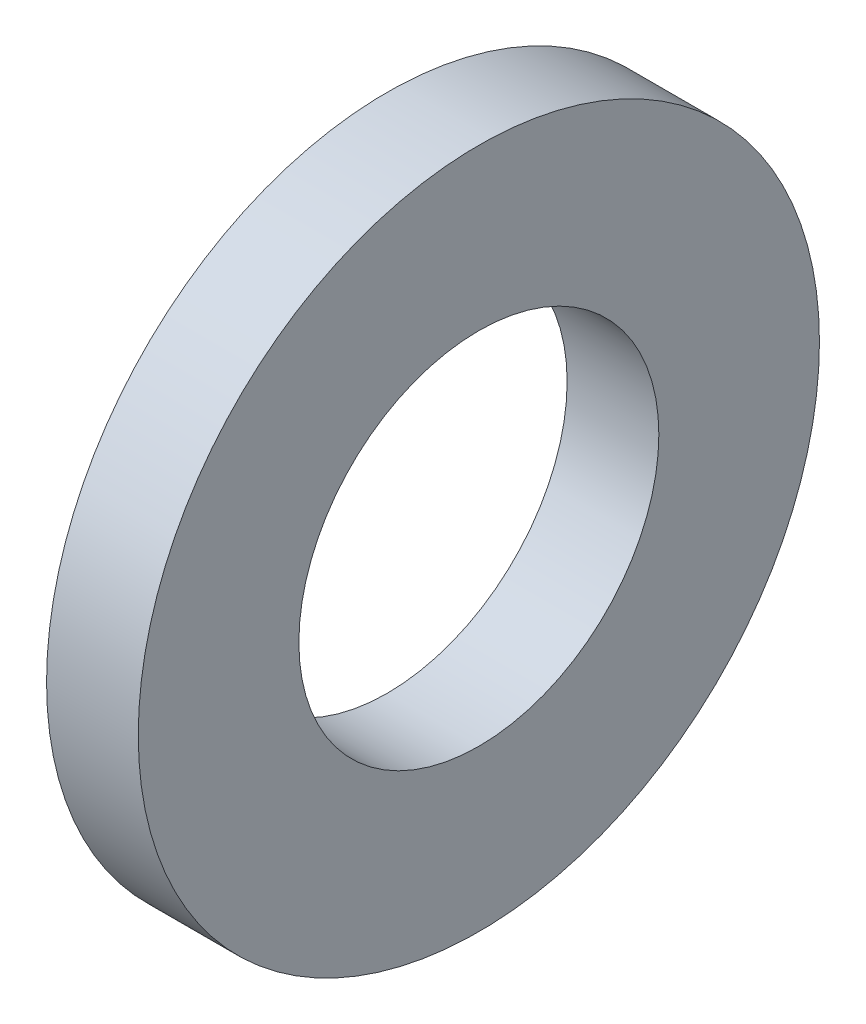
ISO-10303-21;
HEADER;
FILE_DESCRIPTION(('STEP AP214'),'2;1');
FILE_NAME('part.step','',(''),(''),'','','');
FILE_SCHEMA(('AUTOMOTIVE_DESIGN { 1 0 10303 214 1 1 1 1 }'));
ENDSEC;
DATA;
#1=APPLICATION_CONTEXT('core data for automotive mechanical design processes');
#2=APPLICATION_PROTOCOL_DEFINITION('international standard','automotive_design',2000,#1);
#3=PRODUCT_CONTEXT('',#1,'mechanical');
#4=PRODUCT('Part','Part','',(#3));
#5=PRODUCT_RELATED_PRODUCT_CATEGORY('part','',(#4));
#6=PRODUCT_DEFINITION_FORMATION('','',#4);
#7=PRODUCT_DEFINITION_CONTEXT('part definition',#1,'design');
#8=PRODUCT_DEFINITION('design','',#6,#7);
#9=PRODUCT_DEFINITION_SHAPE('','',#8);
#10=(LENGTH_UNIT() NAMED_UNIT(*) SI_UNIT(.MILLI.,.METRE.));
#11=(NAMED_UNIT(*) PLANE_ANGLE_UNIT() SI_UNIT($,.RADIAN.));
#12=(NAMED_UNIT(*) SI_UNIT($,.STERADIAN.) SOLID_ANGLE_UNIT());
#13=UNCERTAINTY_MEASURE_WITH_UNIT(LENGTH_MEASURE(1.E-05),#10,'distance_accuracy_value','');
#14=(GEOMETRIC_REPRESENTATION_CONTEXT(3) GLOBAL_UNCERTAINTY_ASSIGNED_CONTEXT((#13)) GLOBAL_UNIT_ASSIGNED_CONTEXT((#10,
#11,#12)) REPRESENTATION_CONTEXT('',''));
#15=CARTESIAN_POINT('',(0.,0.,0.));
#16=DIRECTION('',(0.,0.,1.));
#17=DIRECTION('',(1.,0.,0.));
#18=AXIS2_PLACEMENT_3D('',#15,#16,#17);
#19=CARTESIAN_POINT('',(-34.9249999999999,0.,0.));
#20=DIRECTION('',(-1.,0.,0.));
#21=DIRECTION('',(0.,0.,1.));
#22=AXIS2_PLACEMENT_3D('',#19,#20,#21);
#23=CYLINDRICAL_SURFACE('',#22,3.435);
#24=CARTESIAN_POINT('',(0.,0.,0.));
#25=DIRECTION('',(-1.,0.,0.));
#26=DIRECTION('',(0.,0.,1.));
#27=AXIS2_PLACEMENT_3D('',#24,#25,#26);
#28=CIRCLE('',#27,3.435);
#29=CARTESIAN_POINT('',(0.,0.,3.435));
#30=VERTEX_POINT('',#29);
#31=EDGE_CURVE('E10',#30,#30,#28,.T.);
#32=ORIENTED_EDGE('',*,*,#31,.F.);
#33=EDGE_LOOP('',(#32));
#34=FACE_BOUND('',#33,.T.);
#35=CARTESIAN_POINT('',(-1.75,0.,0.));
#36=DIRECTION('',(-1.,0.,0.));
#37=DIRECTION('',(0.,0.,1.));
#38=AXIS2_PLACEMENT_3D('',#35,#36,#37);
#39=CIRCLE('',#38,3.435);
#40=CARTESIAN_POINT('',(-1.75,0.,3.435));
#41=VERTEX_POINT('',#40);
#42=EDGE_CURVE('E45',#41,#41,#39,.T.);
#43=ORIENTED_EDGE('',*,*,#42,.T.);
#44=EDGE_LOOP('',(#43));
#45=FACE_BOUND('',#44,.T.);
#46=ADVANCED_FACE('F31',(#34,#45),#23,.F.);
#47=CARTESIAN_POINT('',(0.,3.435,0.));
#48=DIRECTION('',(-1.,0.,0.));
#49=DIRECTION('',(0.,0.,1.));
#50=AXIS2_PLACEMENT_3D('',#47,#48,#49);
#51=PLANE('',#50);
#52=CARTESIAN_POINT('',(0.,0.,0.));
#53=DIRECTION('',(-1.,0.,0.));
#54=DIRECTION('',(0.,0.,1.));
#55=AXIS2_PLACEMENT_3D('',#52,#53,#54);
#56=CIRCLE('',#55,6.5);
#57=CARTESIAN_POINT('',(0.,0.,6.5));
#58=VERTEX_POINT('',#57);
#59=EDGE_CURVE('E37',#58,#58,#56,.T.);
#60=ORIENTED_EDGE('',*,*,#59,.F.);
#61=EDGE_LOOP('',(#60));
#62=FACE_BOUND('',#61,.T.);
#63=ORIENTED_EDGE('',*,*,#31,.T.);
#64=EDGE_LOOP('',(#63));
#65=FACE_BOUND('',#64,.T.);
#66=ADVANCED_FACE('F60',(#62,#65),#51,.F.);
#67=CARTESIAN_POINT('',(-34.9249999999999,0.,0.));
#68=DIRECTION('',(-1.,0.,0.));
#69=DIRECTION('',(0.,0.,1.));
#70=AXIS2_PLACEMENT_3D('',#67,#68,#69);
#71=CYLINDRICAL_SURFACE('',#70,6.5);
#72=CARTESIAN_POINT('',(-1.75,0.,0.));
#73=DIRECTION('',(-1.,0.,0.));
#74=DIRECTION('',(0.,0.,1.));
#75=AXIS2_PLACEMENT_3D('',#72,#73,#74);
#76=CIRCLE('',#75,6.5);
#77=CARTESIAN_POINT('',(-1.75,0.,6.5));
#78=VERTEX_POINT('',#77);
#79=EDGE_CURVE('E41',#78,#78,#76,.T.);
#80=ORIENTED_EDGE('',*,*,#79,.F.);
#81=EDGE_LOOP('',(#80));
#82=FACE_BOUND('',#81,.T.);
#83=ORIENTED_EDGE('',*,*,#59,.T.);
#84=EDGE_LOOP('',(#83));
#85=FACE_BOUND('',#84,.T.);
#86=ADVANCED_FACE('F55',(#82,#85),#71,.T.);
#87=CARTESIAN_POINT('',(-1.75,6.5,0.));
#88=DIRECTION('',(1.,0.,0.));
#89=DIRECTION('',(0.,0.,-1.));
#90=AXIS2_PLACEMENT_3D('',#87,#88,#89);
#91=PLANE('',#90);
#92=ORIENTED_EDGE('',*,*,#42,.F.);
#93=EDGE_LOOP('',(#92));
#94=FACE_BOUND('',#93,.T.);
#95=ORIENTED_EDGE('',*,*,#79,.T.);
#96=EDGE_LOOP('',(#95));
#97=FACE_BOUND('',#96,.T.);
#98=ADVANCED_FACE('F52',(#94,#97),#91,.F.);
#99=CLOSED_SHELL('',(#46,#66,#86,#98));
#100=MANIFOLD_SOLID_BREP('B2',#99);
#101=ADVANCED_BREP_SHAPE_REPRESENTATION('',(#18,#100),#14);
#102=SHAPE_DEFINITION_REPRESENTATION(#9,#101);
ENDSEC;
END-ISO-10303-21;
